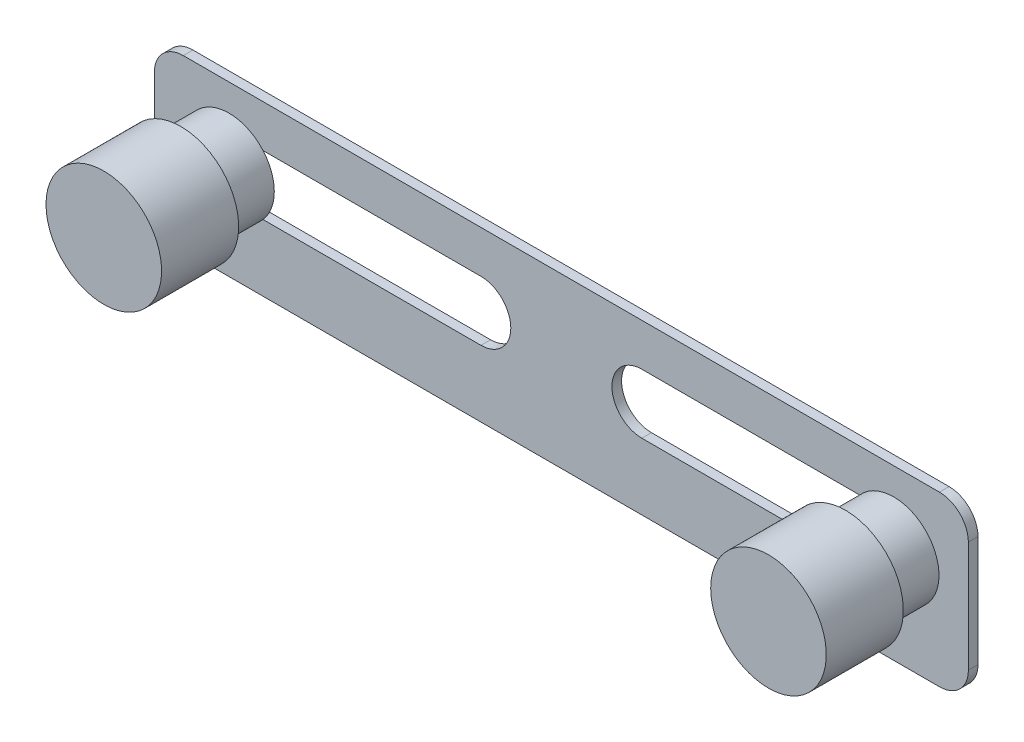
ISO-10303-21;
HEADER;
FILE_DESCRIPTION(('STEP AP214'),'2;1');
FILE_NAME('part.step','',(''),(''),'','','');
FILE_SCHEMA(('AUTOMOTIVE_DESIGN { 1 0 10303 214 1 1 1 1 }'));
ENDSEC;
DATA;
#1=APPLICATION_CONTEXT('core data for automotive mechanical design processes');
#2=APPLICATION_PROTOCOL_DEFINITION('international standard','automotive_design',2000,#1);
#3=PRODUCT_CONTEXT('',#1,'mechanical');
#4=PRODUCT('Part','Part','',(#3));
#5=PRODUCT_RELATED_PRODUCT_CATEGORY('part','',(#4));
#6=PRODUCT_DEFINITION_FORMATION('','',#4);
#7=PRODUCT_DEFINITION_CONTEXT('part definition',#1,'design');
#8=PRODUCT_DEFINITION('design','',#6,#7);
#9=PRODUCT_DEFINITION_SHAPE('','',#8);
#10=(LENGTH_UNIT() NAMED_UNIT(*) SI_UNIT(.MILLI.,.METRE.));
#11=(NAMED_UNIT(*) PLANE_ANGLE_UNIT() SI_UNIT($,.RADIAN.));
#12=(NAMED_UNIT(*) SI_UNIT($,.STERADIAN.) SOLID_ANGLE_UNIT());
#13=UNCERTAINTY_MEASURE_WITH_UNIT(LENGTH_MEASURE(1.E-05),#10,'distance_accuracy_value','');
#14=(GEOMETRIC_REPRESENTATION_CONTEXT(3) GLOBAL_UNCERTAINTY_ASSIGNED_CONTEXT((#13)) GLOBAL_UNIT_ASSIGNED_CONTEXT((#10,
#11,#12)) REPRESENTATION_CONTEXT('',''));
#15=CARTESIAN_POINT('',(0.,0.,0.));
#16=DIRECTION('',(0.,0.,1.));
#17=DIRECTION('',(1.,0.,0.));
#18=AXIS2_PLACEMENT_3D('',#15,#16,#17);
#19=CARTESIAN_POINT('',(76.75,10.,1.));
#20=DIRECTION('',(0.,0.,1.));
#21=DIRECTION('',(-1.,0.,0.));
#22=AXIS2_PLACEMENT_3D('',#19,#20,#21);
#23=PLANE('',#22);
#24=CARTESIAN_POINT('',(76.75,10.,1.));
#25=DIRECTION('',(0.,0.,1.));
#26=DIRECTION('',(1.,0.,0.));
#27=AXIS2_PLACEMENT_3D('',#24,#25,#26);
#28=CIRCLE('',#27,4.7);
#29=CARTESIAN_POINT('',(73.2172956534689,13.1,1.));
#30=VERTEX_POINT('',#29);
#31=CARTESIAN_POINT('',(73.2172956534689,6.90000000000001,1.));
#32=VERTEX_POINT('',#31);
#33=EDGE_CURVE('E11',#30,#32,#28,.T.);
#34=ORIENTED_EDGE('',*,*,#33,.F.);
#35=DIRECTION('',(-1.,0.,0.));
#36=VECTOR('',#35,1.);
#37=CARTESIAN_POINT('',(50.6,13.1,1.));
#38=LINE('',#37,#36);
#39=CARTESIAN_POINT('',(77.9,13.1,1.));
#40=VERTEX_POINT('',#39);
#41=EDGE_CURVE('E201',#40,#30,#38,.T.);
#42=ORIENTED_EDGE('',*,*,#41,.F.);
#43=CARTESIAN_POINT('',(77.9,10.,1.));
#44=DIRECTION('',(0.,0.,1.));
#45=DIRECTION('',(-1.,0.,0.));
#46=AXIS2_PLACEMENT_3D('',#43,#44,#45);
#47=CIRCLE('',#46,3.1);
#48=CARTESIAN_POINT('',(77.9,6.90000000000001,1.));
#49=VERTEX_POINT('',#48);
#50=EDGE_CURVE('E196',#49,#40,#47,.T.);
#51=ORIENTED_EDGE('',*,*,#50,.F.);
#52=DIRECTION('',(1.,0.,0.));
#53=VECTOR('',#52,1.);
#54=CARTESIAN_POINT('',(50.6,6.90000000000001,1.));
#55=LINE('',#54,#53);
#56=EDGE_CURVE('E177',#32,#49,#55,.T.);
#57=ORIENTED_EDGE('',*,*,#56,.F.);
#58=EDGE_LOOP('',(#34,#42,#51,#57));
#59=FACE_BOUND('',#58,.T.);
#60=ADVANCED_FACE('F45',(#59),#23,.F.);
#61=CARTESIAN_POINT('',(7.75,10.,1.));
#62=DIRECTION('',(0.,0.,1.));
#63=DIRECTION('',(1.,0.,0.));
#64=AXIS2_PLACEMENT_3D('',#61,#62,#63);
#65=PLANE('',#64);
#66=DIRECTION('',(-1.,0.,0.));
#67=VECTOR('',#66,1.);
#68=CARTESIAN_POINT('',(33.9,13.1,1.));
#69=LINE('',#68,#67);
#70=CARTESIAN_POINT('',(11.2827043465312,13.1,1.));
#71=VERTEX_POINT('',#70);
#72=CARTESIAN_POINT('',(6.59999999999999,13.1,1.));
#73=VERTEX_POINT('',#72);
#74=EDGE_CURVE('E326',#71,#73,#69,.T.);
#75=ORIENTED_EDGE('',*,*,#74,.F.);
#76=CARTESIAN_POINT('',(7.75,10.,1.));
#77=DIRECTION('',(0.,0.,1.));
#78=DIRECTION('',(1.,0.,0.));
#79=AXIS2_PLACEMENT_3D('',#76,#77,#78);
#80=CIRCLE('',#79,4.7);
#81=CARTESIAN_POINT('',(11.2827043465311,6.90000000000001,1.));
#82=VERTEX_POINT('',#81);
#83=EDGE_CURVE('E54',#71,#82,#80,.F.);
#84=ORIENTED_EDGE('',*,*,#83,.T.);
#85=DIRECTION('',(1.,0.,0.));
#86=VECTOR('',#85,1.);
#87=CARTESIAN_POINT('',(33.9,6.90000000000001,1.));
#88=LINE('',#87,#86);
#89=CARTESIAN_POINT('',(6.59999999999999,6.90000000000001,1.));
#90=VERTEX_POINT('',#89);
#91=EDGE_CURVE('E325',#90,#82,#88,.T.);
#92=ORIENTED_EDGE('',*,*,#91,.F.);
#93=CARTESIAN_POINT('',(6.59999999999999,10.,1.));
#94=DIRECTION('',(0.,0.,1.));
#95=DIRECTION('',(1.,0.,0.));
#96=AXIS2_PLACEMENT_3D('',#93,#94,#95);
#97=CIRCLE('',#96,3.1);
#98=EDGE_CURVE('E341',#73,#90,#97,.T.);
#99=ORIENTED_EDGE('',*,*,#98,.F.);
#100=EDGE_LOOP('',(#75,#84,#92,#99));
#101=FACE_BOUND('',#100,.T.);
#102=ADVANCED_FACE('F323',(#101),#65,.F.);
#103=CARTESIAN_POINT('',(0.,0.,1.));
#104=DIRECTION('',(0.,0.,-1.));
#105=DIRECTION('',(-1.,0.,0.));
#106=AXIS2_PLACEMENT_3D('',#103,#104,#105);
#107=PLANE('',#106);
#108=CARTESIAN_POINT('',(33.9,6.90000000000001,1.));
#109=VERTEX_POINT('',#108);
#110=EDGE_CURVE('E69',#82,#109,#88,.T.);
#111=ORIENTED_EDGE('',*,*,#110,.F.);
#112=CARTESIAN_POINT('',(7.75,10.,1.));
#113=DIRECTION('',(0.,0.,1.));
#114=DIRECTION('',(1.,0.,0.));
#115=AXIS2_PLACEMENT_3D('',#112,#113,#114);
#116=CIRCLE('',#115,4.7);
#117=EDGE_CURVE('E654',#71,#82,#116,.T.);
#118=ORIENTED_EDGE('',*,*,#117,.F.);
#119=CARTESIAN_POINT('',(33.9,13.1,1.));
#120=VERTEX_POINT('',#119);
#121=EDGE_CURVE('E675',#120,#71,#69,.T.);
#122=ORIENTED_EDGE('',*,*,#121,.F.);
#123=CARTESIAN_POINT('',(33.9,10.,1.));
#124=DIRECTION('',(0.,0.,1.));
#125=DIRECTION('',(-1.,0.,0.));
#126=AXIS2_PLACEMENT_3D('',#123,#124,#125);
#127=CIRCLE('',#126,3.1);
#128=EDGE_CURVE('E361',#109,#120,#127,.T.);
#129=ORIENTED_EDGE('',*,*,#128,.F.);
#130=EDGE_LOOP('',(#111,#118,#122,#129));
#131=FACE_BOUND('',#130,.T.);
#132=CARTESIAN_POINT('',(50.6,13.1,1.));
#133=VERTEX_POINT('',#132);
#134=EDGE_CURVE('E61',#30,#133,#38,.T.);
#135=ORIENTED_EDGE('',*,*,#134,.F.);
#136=CARTESIAN_POINT('',(76.75,10.,1.));
#137=DIRECTION('',(0.,0.,-1.));
#138=DIRECTION('',(-1.,0.,0.));
#139=AXIS2_PLACEMENT_3D('',#136,#137,#138);
#140=CIRCLE('',#139,4.7);
#141=EDGE_CURVE('E187',#30,#32,#140,.T.);
#142=ORIENTED_EDGE('',*,*,#141,.T.);
#143=CARTESIAN_POINT('',(50.6,6.90000000000001,1.));
#144=VERTEX_POINT('',#143);
#145=EDGE_CURVE('E172',#144,#32,#55,.T.);
#146=ORIENTED_EDGE('',*,*,#145,.F.);
#147=CARTESIAN_POINT('',(50.6,10.,1.));
#148=DIRECTION('',(0.,0.,1.));
#149=DIRECTION('',(1.,0.,0.));
#150=AXIS2_PLACEMENT_3D('',#147,#148,#149);
#151=CIRCLE('',#150,3.1);
#152=EDGE_CURVE('E199',#133,#144,#151,.T.);
#153=ORIENTED_EDGE('',*,*,#152,.F.);
#154=EDGE_LOOP('',(#135,#142,#146,#153));
#155=FACE_BOUND('',#154,.T.);
#156=DIRECTION('',(0.,1.,0.));
#157=VECTOR('',#156,1.);
#158=CARTESIAN_POINT('',(84.5,0.,1.));
#159=LINE('',#158,#157);
#160=CARTESIAN_POINT('',(84.5,3.,1.));
#161=VERTEX_POINT('',#160);
#162=CARTESIAN_POINT('',(84.5,14.5,1.));
#163=VERTEX_POINT('',#162);
#164=EDGE_CURVE('E243',#161,#163,#159,.T.);
#165=ORIENTED_EDGE('',*,*,#164,.T.);
#166=CARTESIAN_POINT('',(81.5,14.5,1.));
#167=DIRECTION('',(0.,0.,-1.));
#168=DIRECTION('',(-1.,0.,0.));
#169=AXIS2_PLACEMENT_3D('',#166,#167,#168);
#170=CIRCLE('',#169,3.);
#171=CARTESIAN_POINT('',(81.5,17.5,1.));
#172=VERTEX_POINT('',#171);
#173=EDGE_CURVE('E300',#163,#172,#170,.F.);
#174=ORIENTED_EDGE('',*,*,#173,.T.);
#175=DIRECTION('',(-1.,0.,0.));
#176=VECTOR('',#175,1.);
#177=CARTESIAN_POINT('',(0.,17.5,1.));
#178=LINE('',#177,#176);
#179=CARTESIAN_POINT('',(3.,17.5,1.));
#180=VERTEX_POINT('',#179);
#181=EDGE_CURVE('E247',#172,#180,#178,.T.);
#182=ORIENTED_EDGE('',*,*,#181,.T.);
#183=CARTESIAN_POINT('',(3.,14.5,1.));
#184=DIRECTION('',(0.,0.,-1.));
#185=DIRECTION('',(-1.,0.,0.));
#186=AXIS2_PLACEMENT_3D('',#183,#184,#185);
#187=CIRCLE('',#186,3.);
#188=CARTESIAN_POINT('',(0.,14.5,1.));
#189=VERTEX_POINT('',#188);
#190=EDGE_CURVE('E291',#180,#189,#187,.F.);
#191=ORIENTED_EDGE('',*,*,#190,.T.);
#192=DIRECTION('',(0.,-1.,0.));
#193=VECTOR('',#192,1.);
#194=CARTESIAN_POINT('',(0.,0.,1.));
#195=LINE('',#194,#193);
#196=CARTESIAN_POINT('',(0.,3.,1.));
#197=VERTEX_POINT('',#196);
#198=EDGE_CURVE('E234',#189,#197,#195,.T.);
#199=ORIENTED_EDGE('',*,*,#198,.T.);
#200=CARTESIAN_POINT('',(3.,3.,1.));
#201=DIRECTION('',(0.,0.,-1.));
#202=DIRECTION('',(-1.,0.,0.));
#203=AXIS2_PLACEMENT_3D('',#200,#201,#202);
#204=CIRCLE('',#203,3.);
#205=CARTESIAN_POINT('',(3.,0.,1.));
#206=VERTEX_POINT('',#205);
#207=EDGE_CURVE('E294',#197,#206,#204,.F.);
#208=ORIENTED_EDGE('',*,*,#207,.T.);
#209=DIRECTION('',(1.,0.,0.));
#210=VECTOR('',#209,1.);
#211=CARTESIAN_POINT('',(0.,0.,1.));
#212=LINE('',#211,#210);
#213=CARTESIAN_POINT('',(81.5,0.,1.));
#214=VERTEX_POINT('',#213);
#215=EDGE_CURVE('E238',#206,#214,#212,.T.);
#216=ORIENTED_EDGE('',*,*,#215,.T.);
#217=CARTESIAN_POINT('',(81.5,3.,1.));
#218=DIRECTION('',(0.,0.,-1.));
#219=DIRECTION('',(-1.,0.,0.));
#220=AXIS2_PLACEMENT_3D('',#217,#218,#219);
#221=CIRCLE('',#220,3.);
#222=EDGE_CURVE('E297',#214,#161,#221,.F.);
#223=ORIENTED_EDGE('',*,*,#222,.T.);
#224=EDGE_LOOP('',(#165,#174,#182,#191,#199,#208,#216,#223));
#225=FACE_BOUND('',#224,.T.);
#226=ADVANCED_FACE('F190',(#131,#155,#225),#107,.F.);
#227=CARTESIAN_POINT('',(0.,0.,0.));
#228=DIRECTION('',(0.,0.,-1.));
#229=DIRECTION('',(-1.,0.,0.));
#230=AXIS2_PLACEMENT_3D('',#227,#228,#229);
#231=PLANE('',#230);
#232=DIRECTION('',(-1.,0.,0.));
#233=VECTOR('',#232,1.);
#234=CARTESIAN_POINT('',(0.,17.5,0.));
#235=LINE('',#234,#233);
#236=CARTESIAN_POINT('',(81.5,17.5,0.));
#237=VERTEX_POINT('',#236);
#238=CARTESIAN_POINT('',(3.,17.5,0.));
#239=VERTEX_POINT('',#238);
#240=EDGE_CURVE('E239',#237,#239,#235,.T.);
#241=ORIENTED_EDGE('',*,*,#240,.F.);
#242=CARTESIAN_POINT('',(81.5,14.5,0.));
#243=DIRECTION('',(0.,0.,-1.));
#244=DIRECTION('',(-1.,0.,0.));
#245=AXIS2_PLACEMENT_3D('',#242,#243,#244);
#246=CIRCLE('',#245,3.);
#247=CARTESIAN_POINT('',(84.5,14.5,0.));
#248=VERTEX_POINT('',#247);
#249=EDGE_CURVE('E281',#237,#248,#246,.T.);
#250=ORIENTED_EDGE('',*,*,#249,.T.);
#251=DIRECTION('',(0.,1.,0.));
#252=VECTOR('',#251,1.);
#253=CARTESIAN_POINT('',(84.5,0.,0.));
#254=LINE('',#253,#252);
#255=CARTESIAN_POINT('',(84.5,3.,0.));
#256=VERTEX_POINT('',#255);
#257=EDGE_CURVE('E259',#256,#248,#254,.T.);
#258=ORIENTED_EDGE('',*,*,#257,.F.);
#259=CARTESIAN_POINT('',(81.5,3.,0.));
#260=DIRECTION('',(0.,0.,-1.));
#261=DIRECTION('',(-1.,0.,0.));
#262=AXIS2_PLACEMENT_3D('',#259,#260,#261);
#263=CIRCLE('',#262,3.);
#264=CARTESIAN_POINT('',(81.5,0.,0.));
#265=VERTEX_POINT('',#264);
#266=EDGE_CURVE('E278',#256,#265,#263,.T.);
#267=ORIENTED_EDGE('',*,*,#266,.T.);
#268=DIRECTION('',(1.,0.,0.));
#269=VECTOR('',#268,1.);
#270=CARTESIAN_POINT('',(0.,0.,0.));
#271=LINE('',#270,#269);
#272=CARTESIAN_POINT('',(3.,0.,0.));
#273=VERTEX_POINT('',#272);
#274=EDGE_CURVE('E255',#273,#265,#271,.T.);
#275=ORIENTED_EDGE('',*,*,#274,.F.);
#276=CARTESIAN_POINT('',(3.,3.,0.));
#277=DIRECTION('',(0.,0.,-1.));
#278=DIRECTION('',(-1.,0.,0.));
#279=AXIS2_PLACEMENT_3D('',#276,#277,#278);
#280=CIRCLE('',#279,3.);
#281=CARTESIAN_POINT('',(0.,3.,0.));
#282=VERTEX_POINT('',#281);
#283=EDGE_CURVE('E275',#273,#282,#280,.T.);
#284=ORIENTED_EDGE('',*,*,#283,.T.);
#285=DIRECTION('',(0.,-1.,0.));
#286=VECTOR('',#285,1.);
#287=CARTESIAN_POINT('',(0.,0.,0.));
#288=LINE('',#287,#286);
#289=CARTESIAN_POINT('',(0.,14.5,0.));
#290=VERTEX_POINT('',#289);
#291=EDGE_CURVE('E233',#290,#282,#288,.T.);
#292=ORIENTED_EDGE('',*,*,#291,.F.);
#293=CARTESIAN_POINT('',(3.,14.5,0.));
#294=DIRECTION('',(0.,0.,-1.));
#295=DIRECTION('',(-1.,0.,0.));
#296=AXIS2_PLACEMENT_3D('',#293,#294,#295);
#297=CIRCLE('',#296,3.);
#298=EDGE_CURVE('E272',#290,#239,#297,.T.);
#299=ORIENTED_EDGE('',*,*,#298,.T.);
#300=EDGE_LOOP('',(#241,#250,#258,#267,#275,#284,#292,#299));
#301=FACE_BOUND('',#300,.T.);
#302=DIRECTION('',(1.,0.,0.));
#303=VECTOR('',#302,1.);
#304=CARTESIAN_POINT('',(50.6,6.90000000000001,0.));
#305=LINE('',#304,#303);
#306=CARTESIAN_POINT('',(50.6,6.90000000000001,0.));
#307=VERTEX_POINT('',#306);
#308=CARTESIAN_POINT('',(77.9,6.90000000000001,0.));
#309=VERTEX_POINT('',#308);
#310=EDGE_CURVE('E218',#307,#309,#305,.T.);
#311=ORIENTED_EDGE('',*,*,#310,.T.);
#312=CARTESIAN_POINT('',(77.9,10.,0.));
#313=DIRECTION('',(0.,0.,1.));
#314=DIRECTION('',(-1.,0.,0.));
#315=AXIS2_PLACEMENT_3D('',#312,#313,#314);
#316=CIRCLE('',#315,3.1);
#317=CARTESIAN_POINT('',(77.9,13.1,0.));
#318=VERTEX_POINT('',#317);
#319=EDGE_CURVE('E205',#309,#318,#316,.T.);
#320=ORIENTED_EDGE('',*,*,#319,.T.);
#321=DIRECTION('',(-1.,0.,0.));
#322=VECTOR('',#321,1.);
#323=CARTESIAN_POINT('',(50.6,13.1,0.));
#324=LINE('',#323,#322);
#325=CARTESIAN_POINT('',(50.6,13.1,0.));
#326=VERTEX_POINT('',#325);
#327=EDGE_CURVE('E209',#318,#326,#324,.T.);
#328=ORIENTED_EDGE('',*,*,#327,.T.);
#329=CARTESIAN_POINT('',(50.6,10.,0.));
#330=DIRECTION('',(0.,0.,1.));
#331=DIRECTION('',(1.,0.,0.));
#332=AXIS2_PLACEMENT_3D('',#329,#330,#331);
#333=CIRCLE('',#332,3.1);
#334=EDGE_CURVE('E214',#326,#307,#333,.T.);
#335=ORIENTED_EDGE('',*,*,#334,.T.);
#336=EDGE_LOOP('',(#311,#320,#328,#335));
#337=FACE_BOUND('',#336,.T.);
#338=DIRECTION('',(1.,0.,0.));
#339=VECTOR('',#338,1.);
#340=CARTESIAN_POINT('',(33.9,6.90000000000001,0.));
#341=LINE('',#340,#339);
#342=CARTESIAN_POINT('',(6.59999999999999,6.90000000000001,0.));
#343=VERTEX_POINT('',#342);
#344=CARTESIAN_POINT('',(33.9,6.90000000000001,0.));
#345=VERTEX_POINT('',#344);
#346=EDGE_CURVE('E358',#343,#345,#341,.T.);
#347=ORIENTED_EDGE('',*,*,#346,.T.);
#348=CARTESIAN_POINT('',(33.9,10.,0.));
#349=DIRECTION('',(0.,0.,1.));
#350=DIRECTION('',(-1.,0.,0.));
#351=AXIS2_PLACEMENT_3D('',#348,#349,#350);
#352=CIRCLE('',#351,3.1);
#353=CARTESIAN_POINT('',(33.9,13.1,0.));
#354=VERTEX_POINT('',#353);
#355=EDGE_CURVE('E345',#345,#354,#352,.T.);
#356=ORIENTED_EDGE('',*,*,#355,.T.);
#357=DIRECTION('',(-1.,0.,0.));
#358=VECTOR('',#357,1.);
#359=CARTESIAN_POINT('',(33.9,13.1,0.));
#360=LINE('',#359,#358);
#361=CARTESIAN_POINT('',(6.59999999999999,13.1,0.));
#362=VERTEX_POINT('',#361);
#363=EDGE_CURVE('E349',#354,#362,#360,.T.);
#364=ORIENTED_EDGE('',*,*,#363,.T.);
#365=CARTESIAN_POINT('',(6.59999999999999,10.,0.));
#366=DIRECTION('',(0.,0.,1.));
#367=DIRECTION('',(1.,0.,0.));
#368=AXIS2_PLACEMENT_3D('',#365,#366,#367);
#369=CIRCLE('',#368,3.1);
#370=EDGE_CURVE('E354',#362,#343,#369,.T.);
#371=ORIENTED_EDGE('',*,*,#370,.T.);
#372=EDGE_LOOP('',(#347,#356,#364,#371));
#373=FACE_BOUND('',#372,.T.);
#374=ADVANCED_FACE('F382',(#301,#337,#373),#231,.T.);
#375=CARTESIAN_POINT('',(0.,0.,1.));
#376=DIRECTION('',(1.,0.,0.));
#377=DIRECTION('',(0.,0.,-1.));
#378=AXIS2_PLACEMENT_3D('',#375,#376,#377);
#379=PLANE('',#378);
#380=ORIENTED_EDGE('',*,*,#291,.T.);
#381=DIRECTION('',(0.,0.,-1.));
#382=VECTOR('',#381,1.);
#383=CARTESIAN_POINT('',(0.,3.,1.));
#384=LINE('',#383,#382);
#385=EDGE_CURVE('E314',#282,#197,#384,.F.);
#386=ORIENTED_EDGE('',*,*,#385,.T.);
#387=ORIENTED_EDGE('',*,*,#198,.F.);
#388=DIRECTION('',(0.,0.,-1.));
#389=VECTOR('',#388,1.);
#390=CARTESIAN_POINT('',(0.,14.5,1.));
#391=LINE('',#390,#389);
#392=EDGE_CURVE('E310',#189,#290,#391,.T.);
#393=ORIENTED_EDGE('',*,*,#392,.T.);
#394=EDGE_LOOP('',(#380,#386,#387,#393));
#395=FACE_BOUND('',#394,.T.);
#396=ADVANCED_FACE('F465',(#395),#379,.F.);
#397=CARTESIAN_POINT('',(0.,0.,1.));
#398=DIRECTION('',(0.,1.,0.));
#399=DIRECTION('',(0.,0.,1.));
#400=AXIS2_PLACEMENT_3D('',#397,#398,#399);
#401=PLANE('',#400);
#402=ORIENTED_EDGE('',*,*,#274,.T.);
#403=DIRECTION('',(0.,0.,-1.));
#404=VECTOR('',#403,1.);
#405=CARTESIAN_POINT('',(81.5,0.,1.));
#406=LINE('',#405,#404);
#407=EDGE_CURVE('E307',#265,#214,#406,.F.);
#408=ORIENTED_EDGE('',*,*,#407,.T.);
#409=ORIENTED_EDGE('',*,*,#215,.F.);
#410=DIRECTION('',(0.,0.,-1.));
#411=VECTOR('',#410,1.);
#412=CARTESIAN_POINT('',(3.,0.,1.));
#413=LINE('',#412,#411);
#414=EDGE_CURVE('E303',#206,#273,#413,.T.);
#415=ORIENTED_EDGE('',*,*,#414,.T.);
#416=EDGE_LOOP('',(#402,#408,#409,#415));
#417=FACE_BOUND('',#416,.T.);
#418=ADVANCED_FACE('F475',(#417),#401,.F.);
#419=CARTESIAN_POINT('',(84.5,0.,1.));
#420=DIRECTION('',(-1.,0.,0.));
#421=DIRECTION('',(0.,0.,1.));
#422=AXIS2_PLACEMENT_3D('',#419,#420,#421);
#423=PLANE('',#422);
#424=ORIENTED_EDGE('',*,*,#257,.T.);
#425=DIRECTION('',(0.,0.,-1.));
#426=VECTOR('',#425,1.);
#427=CARTESIAN_POINT('',(84.5,14.5,1.));
#428=LINE('',#427,#426);
#429=EDGE_CURVE('E288',#248,#163,#428,.F.);
#430=ORIENTED_EDGE('',*,*,#429,.T.);
#431=ORIENTED_EDGE('',*,*,#164,.F.);
#432=DIRECTION('',(0.,0.,-1.));
#433=VECTOR('',#432,1.);
#434=CARTESIAN_POINT('',(84.5,3.,1.));
#435=LINE('',#434,#433);
#436=EDGE_CURVE('E284',#161,#256,#435,.T.);
#437=ORIENTED_EDGE('',*,*,#436,.T.);
#438=EDGE_LOOP('',(#424,#430,#431,#437));
#439=FACE_BOUND('',#438,.T.);
#440=ADVANCED_FACE('F395',(#439),#423,.F.);
#441=CARTESIAN_POINT('',(0.,17.5,1.));
#442=DIRECTION('',(0.,-1.,0.));
#443=DIRECTION('',(0.,0.,-1.));
#444=AXIS2_PLACEMENT_3D('',#441,#442,#443);
#445=PLANE('',#444);
#446=ORIENTED_EDGE('',*,*,#181,.F.);
#447=DIRECTION('',(0.,0.,-1.));
#448=VECTOR('',#447,1.);
#449=CARTESIAN_POINT('',(81.5,17.5,1.));
#450=LINE('',#449,#448);
#451=EDGE_CURVE('E268',#172,#237,#450,.T.);
#452=ORIENTED_EDGE('',*,*,#451,.T.);
#453=ORIENTED_EDGE('',*,*,#240,.T.);
#454=DIRECTION('',(0.,0.,-1.));
#455=VECTOR('',#454,1.);
#456=CARTESIAN_POINT('',(3.,17.5,1.));
#457=LINE('',#456,#455);
#458=EDGE_CURVE('E251',#239,#180,#457,.F.);
#459=ORIENTED_EDGE('',*,*,#458,.T.);
#460=EDGE_LOOP('',(#446,#452,#453,#459));
#461=FACE_BOUND('',#460,.T.);
#462=ADVANCED_FACE('F387',(#461),#445,.F.);
#463=CARTESIAN_POINT('',(77.9,10.,1.));
#464=DIRECTION('',(0.,0.,-1.));
#465=DIRECTION('',(-1.,0.,0.));
#466=AXIS2_PLACEMENT_3D('',#463,#464,#465);
#467=CYLINDRICAL_SURFACE('',#466,3.1);
#468=ORIENTED_EDGE('',*,*,#319,.F.);
#469=DIRECTION('',(0.,0.,-1.));
#470=VECTOR('',#469,1.);
#471=CARTESIAN_POINT('',(77.9,6.90000000000001,1.));
#472=LINE('',#471,#470);
#473=EDGE_CURVE('E182',#49,#309,#472,.T.);
#474=ORIENTED_EDGE('',*,*,#473,.F.);
#475=ORIENTED_EDGE('',*,*,#50,.T.);
#476=DIRECTION('',(0.,0.,-1.));
#477=VECTOR('',#476,1.);
#478=CARTESIAN_POINT('',(77.9,13.1,1.));
#479=LINE('',#478,#477);
#480=EDGE_CURVE('E229',#40,#318,#479,.T.);
#481=ORIENTED_EDGE('',*,*,#480,.T.);
#482=EDGE_LOOP('',(#468,#474,#475,#481));
#483=FACE_BOUND('',#482,.T.);
#484=ADVANCED_FACE('F385',(#483),#467,.F.);
#485=CARTESIAN_POINT('',(50.6,13.1,1.));
#486=DIRECTION('',(0.,-1.,0.));
#487=DIRECTION('',(0.,0.,-1.));
#488=AXIS2_PLACEMENT_3D('',#485,#486,#487);
#489=PLANE('',#488);
#490=ORIENTED_EDGE('',*,*,#327,.F.);
#491=ORIENTED_EDGE('',*,*,#480,.F.);
#492=ORIENTED_EDGE('',*,*,#41,.T.);
#493=ORIENTED_EDGE('',*,*,#134,.T.);
#494=DIRECTION('',(0.,0.,-1.));
#495=VECTOR('',#494,1.);
#496=CARTESIAN_POINT('',(50.6,13.1,1.));
#497=LINE('',#496,#495);
#498=EDGE_CURVE('E226',#133,#326,#497,.T.);
#499=ORIENTED_EDGE('',*,*,#498,.T.);
#500=EDGE_LOOP('',(#490,#491,#492,#493,#499));
#501=FACE_BOUND('',#500,.T.);
#502=ADVANCED_FACE('F377',(#501),#489,.T.);
#503=CARTESIAN_POINT('',(50.6,10.,1.));
#504=DIRECTION('',(0.,0.,-1.));
#505=DIRECTION('',(-1.,0.,0.));
#506=AXIS2_PLACEMENT_3D('',#503,#504,#505);
#507=CYLINDRICAL_SURFACE('',#506,3.1);
#508=ORIENTED_EDGE('',*,*,#334,.F.);
#509=ORIENTED_EDGE('',*,*,#498,.F.);
#510=ORIENTED_EDGE('',*,*,#152,.T.);
#511=DIRECTION('',(0.,0.,-1.));
#512=VECTOR('',#511,1.);
#513=CARTESIAN_POINT('',(50.6,6.90000000000001,1.));
#514=LINE('',#513,#512);
#515=EDGE_CURVE('E179',#144,#307,#514,.T.);
#516=ORIENTED_EDGE('',*,*,#515,.T.);
#517=EDGE_LOOP('',(#508,#509,#510,#516));
#518=FACE_BOUND('',#517,.T.);
#519=ADVANCED_FACE('F380',(#518),#507,.F.);
#520=CARTESIAN_POINT('',(50.6,6.90000000000001,1.));
#521=DIRECTION('',(0.,1.,0.));
#522=DIRECTION('',(0.,0.,1.));
#523=AXIS2_PLACEMENT_3D('',#520,#521,#522);
#524=PLANE('',#523);
#525=ORIENTED_EDGE('',*,*,#310,.F.);
#526=ORIENTED_EDGE('',*,*,#515,.F.);
#527=ORIENTED_EDGE('',*,*,#145,.T.);
#528=ORIENTED_EDGE('',*,*,#56,.T.);
#529=ORIENTED_EDGE('',*,*,#473,.T.);
#530=EDGE_LOOP('',(#525,#526,#527,#528,#529));
#531=FACE_BOUND('',#530,.T.);
#532=ADVANCED_FACE('F174',(#531),#524,.T.);
#533=CARTESIAN_POINT('',(33.9,10.,1.));
#534=DIRECTION('',(0.,0.,-1.));
#535=DIRECTION('',(-1.,0.,0.));
#536=AXIS2_PLACEMENT_3D('',#533,#534,#535);
#537=CYLINDRICAL_SURFACE('',#536,3.1);
#538=ORIENTED_EDGE('',*,*,#355,.F.);
#539=DIRECTION('',(0.,0.,-1.));
#540=VECTOR('',#539,1.);
#541=CARTESIAN_POINT('',(33.9,6.90000000000001,1.));
#542=LINE('',#541,#540);
#543=EDGE_CURVE('E336',#109,#345,#542,.T.);
#544=ORIENTED_EDGE('',*,*,#543,.F.);
#545=ORIENTED_EDGE('',*,*,#128,.T.);
#546=DIRECTION('',(0.,0.,-1.));
#547=VECTOR('',#546,1.);
#548=CARTESIAN_POINT('',(33.9,13.1,1.));
#549=LINE('',#548,#547);
#550=EDGE_CURVE('E210',#120,#354,#549,.T.);
#551=ORIENTED_EDGE('',*,*,#550,.T.);
#552=EDGE_LOOP('',(#538,#544,#545,#551));
#553=FACE_BOUND('',#552,.T.);
#554=ADVANCED_FACE('F440',(#553),#537,.F.);
#555=CARTESIAN_POINT('',(33.9,13.1,1.));
#556=DIRECTION('',(0.,-1.,0.));
#557=DIRECTION('',(0.,0.,-1.));
#558=AXIS2_PLACEMENT_3D('',#555,#556,#557);
#559=PLANE('',#558);
#560=ORIENTED_EDGE('',*,*,#363,.F.);
#561=ORIENTED_EDGE('',*,*,#550,.F.);
#562=ORIENTED_EDGE('',*,*,#121,.T.);
#563=ORIENTED_EDGE('',*,*,#74,.T.);
#564=DIRECTION('',(0.,0.,-1.));
#565=VECTOR('',#564,1.);
#566=CARTESIAN_POINT('',(6.59999999999999,13.1,1.));
#567=LINE('',#566,#565);
#568=EDGE_CURVE('E365',#73,#362,#567,.T.);
#569=ORIENTED_EDGE('',*,*,#568,.T.);
#570=EDGE_LOOP('',(#560,#561,#562,#563,#569));
#571=FACE_BOUND('',#570,.T.);
#572=ADVANCED_FACE('F436',(#571),#559,.T.);
#573=CARTESIAN_POINT('',(6.59999999999999,10.,1.));
#574=DIRECTION('',(0.,0.,-1.));
#575=DIRECTION('',(-1.,0.,0.));
#576=AXIS2_PLACEMENT_3D('',#573,#574,#575);
#577=CYLINDRICAL_SURFACE('',#576,3.1);
#578=ORIENTED_EDGE('',*,*,#370,.F.);
#579=ORIENTED_EDGE('',*,*,#568,.F.);
#580=ORIENTED_EDGE('',*,*,#98,.T.);
#581=DIRECTION('',(0.,0.,-1.));
#582=VECTOR('',#581,1.);
#583=CARTESIAN_POINT('',(6.59999999999999,6.90000000000001,1.));
#584=LINE('',#583,#582);
#585=EDGE_CURVE('E333',#90,#343,#584,.T.);
#586=ORIENTED_EDGE('',*,*,#585,.T.);
#587=EDGE_LOOP('',(#578,#579,#580,#586));
#588=FACE_BOUND('',#587,.T.);
#589=ADVANCED_FACE('F433',(#588),#577,.F.);
#590=CARTESIAN_POINT('',(33.9,6.90000000000001,1.));
#591=DIRECTION('',(0.,1.,0.));
#592=DIRECTION('',(0.,0.,1.));
#593=AXIS2_PLACEMENT_3D('',#590,#591,#592);
#594=PLANE('',#593);
#595=ORIENTED_EDGE('',*,*,#346,.F.);
#596=ORIENTED_EDGE('',*,*,#585,.F.);
#597=ORIENTED_EDGE('',*,*,#91,.T.);
#598=ORIENTED_EDGE('',*,*,#110,.T.);
#599=ORIENTED_EDGE('',*,*,#543,.T.);
#600=EDGE_LOOP('',(#595,#596,#597,#598,#599));
#601=FACE_BOUND('',#600,.T.);
#602=ADVANCED_FACE('F330',(#601),#594,.T.);
#603=CARTESIAN_POINT('',(81.5,14.5,1.));
#604=DIRECTION('',(0.,0.,-1.));
#605=DIRECTION('',(-1.,0.,0.));
#606=AXIS2_PLACEMENT_3D('',#603,#604,#605);
#607=CYLINDRICAL_SURFACE('',#606,3.);
#608=ORIENTED_EDGE('',*,*,#173,.F.);
#609=ORIENTED_EDGE('',*,*,#429,.F.);
#610=ORIENTED_EDGE('',*,*,#249,.F.);
#611=ORIENTED_EDGE('',*,*,#451,.F.);
#612=EDGE_LOOP('',(#608,#609,#610,#611));
#613=FACE_BOUND('',#612,.T.);
#614=ADVANCED_FACE('F432',(#613),#607,.T.);
#615=CARTESIAN_POINT('',(81.5,3.,1.));
#616=DIRECTION('',(0.,0.,-1.));
#617=DIRECTION('',(-1.,0.,0.));
#618=AXIS2_PLACEMENT_3D('',#615,#616,#617);
#619=CYLINDRICAL_SURFACE('',#618,3.);
#620=ORIENTED_EDGE('',*,*,#222,.F.);
#621=ORIENTED_EDGE('',*,*,#407,.F.);
#622=ORIENTED_EDGE('',*,*,#266,.F.);
#623=ORIENTED_EDGE('',*,*,#436,.F.);
#624=EDGE_LOOP('',(#620,#621,#622,#623));
#625=FACE_BOUND('',#624,.T.);
#626=ADVANCED_FACE('F505',(#625),#619,.T.);
#627=CARTESIAN_POINT('',(3.,3.,1.));
#628=DIRECTION('',(0.,0.,-1.));
#629=DIRECTION('',(-1.,0.,0.));
#630=AXIS2_PLACEMENT_3D('',#627,#628,#629);
#631=CYLINDRICAL_SURFACE('',#630,3.);
#632=ORIENTED_EDGE('',*,*,#207,.F.);
#633=ORIENTED_EDGE('',*,*,#385,.F.);
#634=ORIENTED_EDGE('',*,*,#283,.F.);
#635=ORIENTED_EDGE('',*,*,#414,.F.);
#636=EDGE_LOOP('',(#632,#633,#634,#635));
#637=FACE_BOUND('',#636,.T.);
#638=ADVANCED_FACE('F515',(#637),#631,.T.);
#639=CARTESIAN_POINT('',(3.,14.5,1.));
#640=DIRECTION('',(0.,0.,-1.));
#641=DIRECTION('',(-1.,0.,0.));
#642=AXIS2_PLACEMENT_3D('',#639,#640,#641);
#643=CYLINDRICAL_SURFACE('',#642,3.);
#644=ORIENTED_EDGE('',*,*,#190,.F.);
#645=ORIENTED_EDGE('',*,*,#458,.F.);
#646=ORIENTED_EDGE('',*,*,#298,.F.);
#647=ORIENTED_EDGE('',*,*,#392,.F.);
#648=EDGE_LOOP('',(#644,#645,#646,#647));
#649=FACE_BOUND('',#648,.T.);
#650=ADVANCED_FACE('F47',(#649),#643,.T.);
#651=CARTESIAN_POINT('',(7.75,10.,6.));
#652=DIRECTION('',(0.,0.,1.));
#653=DIRECTION('',(1.,0.,0.));
#654=AXIS2_PLACEMENT_3D('',#651,#652,#653);
#655=PLANE('',#654);
#656=CARTESIAN_POINT('',(7.75,10.,6.));
#657=DIRECTION('',(0.,0.,1.));
#658=DIRECTION('',(1.,0.,0.));
#659=AXIS2_PLACEMENT_3D('',#656,#657,#658);
#660=CIRCLE('',#659,6.);
#661=CARTESIAN_POINT('',(1.75000000000001,10.,6.));
#662=VERTEX_POINT('',#661);
#663=EDGE_CURVE('E666',#662,#662,#660,.T.);
#664=ORIENTED_EDGE('',*,*,#663,.F.);
#665=EDGE_LOOP('',(#664));
#666=FACE_BOUND('',#665,.T.);
#667=CARTESIAN_POINT('',(7.75,10.,6.));
#668=DIRECTION('',(0.,0.,1.));
#669=DIRECTION('',(1.,0.,0.));
#670=AXIS2_PLACEMENT_3D('',#667,#668,#669);
#671=CIRCLE('',#670,4.7);
#672=CARTESIAN_POINT('',(12.45,10.,6.));
#673=VERTEX_POINT('',#672);
#674=EDGE_CURVE('E659',#673,#673,#671,.T.);
#675=ORIENTED_EDGE('',*,*,#674,.T.);
#676=EDGE_LOOP('',(#675));
#677=FACE_BOUND('',#676,.T.);
#678=ADVANCED_FACE('F418',(#666,#677),#655,.F.);
#679=CARTESIAN_POINT('',(7.75,10.,6.));
#680=DIRECTION('',(0.,0.,-1.));
#681=DIRECTION('',(-1.,0.,0.));
#682=AXIS2_PLACEMENT_3D('',#679,#680,#681);
#683=CYLINDRICAL_SURFACE('',#682,4.7);
#684=ORIENTED_EDGE('',*,*,#674,.F.);
#685=EDGE_LOOP('',(#684));
#686=FACE_BOUND('',#685,.T.);
#687=ORIENTED_EDGE('',*,*,#117,.T.);
#688=ORIENTED_EDGE('',*,*,#83,.F.);
#689=EDGE_LOOP('',(#687,#688));
#690=FACE_BOUND('',#689,.T.);
#691=ADVANCED_FACE('F414',(#686,#690),#683,.T.);
#692=CARTESIAN_POINT('',(7.75,10.,14.));
#693=DIRECTION('',(0.,0.,1.));
#694=DIRECTION('',(1.,0.,0.));
#695=AXIS2_PLACEMENT_3D('',#692,#693,#694);
#696=PLANE('',#695);
#697=CARTESIAN_POINT('',(7.75,10.,14.));
#698=DIRECTION('',(0.,0.,1.));
#699=DIRECTION('',(1.,0.,0.));
#700=AXIS2_PLACEMENT_3D('',#697,#698,#699);
#701=CIRCLE('',#700,6.);
#702=CARTESIAN_POINT('',(1.75000000000001,10.,14.));
#703=VERTEX_POINT('',#702);
#704=EDGE_CURVE('E350',#703,#703,#701,.T.);
#705=ORIENTED_EDGE('',*,*,#704,.T.);
#706=EDGE_LOOP('',(#705));
#707=FACE_BOUND('',#706,.T.);
#708=ADVANCED_FACE('F417',(#707),#696,.T.);
#709=CARTESIAN_POINT('',(7.75,10.,14.));
#710=DIRECTION('',(0.,0.,-1.));
#711=DIRECTION('',(-1.,0.,0.));
#712=AXIS2_PLACEMENT_3D('',#709,#710,#711);
#713=CYLINDRICAL_SURFACE('',#712,6.);
#714=CARTESIAN_POINT('',(1.75000000000001,10.,6.));
#715=CARTESIAN_POINT('',(1.75000000000001,10.,6.08333333333333));
#716=CARTESIAN_POINT('',(1.75000000000001,10.,6.16666666666667));
#717=CARTESIAN_POINT('',(1.75000000000001,10.,6.33333333333333));
#718=CARTESIAN_POINT('',(1.75000000000001,10.,6.41666666666667));
#719=CARTESIAN_POINT('',(1.75000000000001,10.,6.58333333333333));
#720=CARTESIAN_POINT('',(1.75000000000001,10.,6.66666666666667));
#721=CARTESIAN_POINT('',(1.75000000000001,10.,6.83333333333333));
#722=CARTESIAN_POINT('',(1.75000000000001,10.,6.91666666666667));
#723=CARTESIAN_POINT('',(1.75000000000001,10.,7.08333333333333));
#724=CARTESIAN_POINT('',(1.75000000000001,10.,7.16666666666667));
#725=CARTESIAN_POINT('',(1.75000000000001,10.,7.33333333333333));
#726=CARTESIAN_POINT('',(1.75000000000001,10.,7.41666666666667));
#727=CARTESIAN_POINT('',(1.75000000000001,10.,7.58333333333333));
#728=CARTESIAN_POINT('',(1.75000000000001,10.,7.66666666666667));
#729=CARTESIAN_POINT('',(1.75000000000001,10.,7.83333333333333));
#730=CARTESIAN_POINT('',(1.75000000000001,10.,7.91666666666667));
#731=CARTESIAN_POINT('',(1.75000000000001,10.,8.08333333333333));
#732=CARTESIAN_POINT('',(1.75000000000001,10.,8.16666666666667));
#733=CARTESIAN_POINT('',(1.75000000000001,10.,8.33333333333333));
#734=CARTESIAN_POINT('',(1.75000000000001,10.,8.41666666666667));
#735=CARTESIAN_POINT('',(1.75000000000001,10.,8.58333333333333));
#736=CARTESIAN_POINT('',(1.75000000000001,10.,8.66666666666667));
#737=CARTESIAN_POINT('',(1.75000000000001,10.,8.83333333333333));
#738=CARTESIAN_POINT('',(1.75000000000001,10.,8.91666666666667));
#739=CARTESIAN_POINT('',(1.75000000000001,10.,9.08333333333333));
#740=CARTESIAN_POINT('',(1.75000000000001,10.,9.16666666666667));
#741=CARTESIAN_POINT('',(1.75000000000001,10.,9.33333333333333));
#742=CARTESIAN_POINT('',(1.75000000000001,10.,9.41666666666667));
#743=CARTESIAN_POINT('',(1.75000000000001,10.,9.58333333333333));
#744=CARTESIAN_POINT('',(1.75000000000001,10.,9.66666666666667));
#745=CARTESIAN_POINT('',(1.75000000000001,10.,9.83333333333333));
#746=CARTESIAN_POINT('',(1.75000000000001,10.,9.91666666666667));
#747=CARTESIAN_POINT('',(1.75000000000001,10.,10.0833333333333));
#748=CARTESIAN_POINT('',(1.75000000000001,10.,10.1666666666667));
#749=CARTESIAN_POINT('',(1.75000000000001,10.,10.3333333333333));
#750=CARTESIAN_POINT('',(1.75000000000001,10.,10.4166666666667));
#751=CARTESIAN_POINT('',(1.75000000000001,10.,10.5833333333333));
#752=CARTESIAN_POINT('',(1.75000000000001,10.,10.6666666666667));
#753=CARTESIAN_POINT('',(1.75000000000001,10.,10.8333333333333));
#754=CARTESIAN_POINT('',(1.75000000000001,10.,10.9166666666667));
#755=CARTESIAN_POINT('',(1.75000000000001,10.,11.0833333333333));
#756=CARTESIAN_POINT('',(1.75000000000001,10.,11.1666666666667));
#757=CARTESIAN_POINT('',(1.75000000000001,10.,11.3333333333333));
#758=CARTESIAN_POINT('',(1.75000000000001,10.,11.4166666666667));
#759=CARTESIAN_POINT('',(1.75000000000001,10.,11.5833333333333));
#760=CARTESIAN_POINT('',(1.75000000000001,10.,11.6666666666667));
#761=CARTESIAN_POINT('',(1.75000000000001,10.,11.8333333333333));
#762=CARTESIAN_POINT('',(1.75000000000001,10.,11.9166666666667));
#763=CARTESIAN_POINT('',(1.75000000000001,10.,12.0833333333333));
#764=CARTESIAN_POINT('',(1.75000000000001,10.,12.1666666666667));
#765=CARTESIAN_POINT('',(1.75000000000001,10.,12.3333333333333));
#766=CARTESIAN_POINT('',(1.75000000000001,10.,12.4166666666667));
#767=CARTESIAN_POINT('',(1.75000000000001,10.,12.5833333333333));
#768=CARTESIAN_POINT('',(1.75000000000001,10.,12.6666666666667));
#769=CARTESIAN_POINT('',(1.75000000000001,10.,12.8333333333333));
#770=CARTESIAN_POINT('',(1.75000000000001,10.,12.9166666666667));
#771=CARTESIAN_POINT('',(1.75000000000001,10.,13.0833333333333));
#772=CARTESIAN_POINT('',(1.75000000000001,10.,13.1666666666667));
#773=CARTESIAN_POINT('',(1.75000000000001,10.,13.3333333333333));
#774=CARTESIAN_POINT('',(1.75000000000001,10.,13.4166666666667));
#775=CARTESIAN_POINT('',(1.75000000000001,10.,13.5833333333333));
#776=CARTESIAN_POINT('',(1.75000000000001,10.,13.6666666666667));
#777=CARTESIAN_POINT('',(1.75000000000001,10.,13.8333333333333));
#778=CARTESIAN_POINT('',(1.75000000000001,10.,13.9166666666667));
#779=CARTESIAN_POINT('',(1.75000000000001,10.,14.));
#780=B_SPLINE_CURVE_WITH_KNOTS('',3,(#714,#715,#716,#717,#718,#719,#720,#721,#722,#723,#724,
#725,#726,#727,#728,#729,#730,#731,#732,#733,#734,#735,#736,#737,#738,#739,#740,#741,#742,#743,
#744,#745,#746,#747,#748,#749,#750,#751,#752,#753,#754,#755,#756,#757,#758,#759,#760,#761,#762,
#763,#764,#765,#766,#767,#768,#769,#770,#771,#772,#773,#774,#775,#776,#777,#778,#779),
.UNSPECIFIED.,.F.,.F.,(4,2,2,2,2,2,2,2,2,2,2,2,2,2,2,2,2,2,2,2,2,2,2,2,2,2,2,2,2,2,2,2,4),(0.,
0.249999999999999,0.5,0.749999999999999,0.999999999999999,1.25,1.5,1.75,2.,2.25,2.5,2.75,3.,
3.25,3.5,3.75,4.,4.25,4.5,4.75,5.,5.25,5.5,5.75,6.,6.25,6.5,6.75,7.,7.25,7.5,7.75,8.),.UNSPECIFIED.);
#781=EDGE_CURVE('BSEAM424',#662,#703,#780,.T.);
#782=ORIENTED_EDGE('',*,*,#663,.T.);
#783=ORIENTED_EDGE('',*,*,#704,.F.);
#784=ORIENTED_EDGE('',*,*,#781,.T.);
#785=ORIENTED_EDGE('',*,*,#781,.F.);
#786=EDGE_LOOP('',(#782,#784,#783,#785));
#787=FACE_BOUND('',#786,.T.);
#788=ADVANCED_FACE('F424',(#787),#713,.T.);
#789=CARTESIAN_POINT('',(76.75,10.,6.));
#790=DIRECTION('',(0.,0.,1.));
#791=DIRECTION('',(-1.,0.,0.));
#792=AXIS2_PLACEMENT_3D('',#789,#790,#791);
#793=PLANE('',#792);
#794=CARTESIAN_POINT('',(76.75,10.,6.));
#795=DIRECTION('',(0.,0.,-1.));
#796=DIRECTION('',(-1.,0.,0.));
#797=AXIS2_PLACEMENT_3D('',#794,#795,#796);
#798=CIRCLE('',#797,4.7);
#799=CARTESIAN_POINT('',(72.05,10.,6.));
#800=VERTEX_POINT('',#799);
#801=EDGE_CURVE('E193',#800,#800,#798,.T.);
#802=ORIENTED_EDGE('',*,*,#801,.F.);
#803=EDGE_LOOP('',(#802));
#804=FACE_BOUND('',#803,.T.);
#805=CARTESIAN_POINT('',(76.75,10.,6.));
#806=DIRECTION('',(0.,0.,-1.));
#807=DIRECTION('',(-1.,0.,0.));
#808=AXIS2_PLACEMENT_3D('',#805,#806,#807);
#809=CIRCLE('',#808,6.);
#810=CARTESIAN_POINT('',(70.75,10.,6.));
#811=VERTEX_POINT('',#810);
#812=EDGE_CURVE('E655',#811,#811,#809,.T.);
#813=ORIENTED_EDGE('',*,*,#812,.T.);
#814=EDGE_LOOP('',(#813));
#815=FACE_BOUND('',#814,.T.);
#816=ADVANCED_FACE('F428',(#804,#815),#793,.F.);
#817=CARTESIAN_POINT('',(76.75,10.,6.));
#818=DIRECTION('',(0.,0.,-1.));
#819=DIRECTION('',(-1.,0.,0.));
#820=AXIS2_PLACEMENT_3D('',#817,#818,#819);
#821=CYLINDRICAL_SURFACE('',#820,4.7);
#822=ORIENTED_EDGE('',*,*,#801,.T.);
#823=EDGE_LOOP('',(#822));
#824=FACE_BOUND('',#823,.T.);
#825=ORIENTED_EDGE('',*,*,#141,.F.);
#826=ORIENTED_EDGE('',*,*,#33,.T.);
#827=EDGE_LOOP('',(#825,#826));
#828=FACE_BOUND('',#827,.T.);
#829=ADVANCED_FACE('F186',(#824,#828),#821,.T.);
#830=CARTESIAN_POINT('',(76.75,10.,14.));
#831=DIRECTION('',(0.,0.,1.));
#832=DIRECTION('',(-1.,0.,0.));
#833=AXIS2_PLACEMENT_3D('',#830,#831,#832);
#834=PLANE('',#833);
#835=CARTESIAN_POINT('',(76.75,10.,14.));
#836=DIRECTION('',(0.,0.,-1.));
#837=DIRECTION('',(-1.,0.,0.));
#838=AXIS2_PLACEMENT_3D('',#835,#836,#837);
#839=CIRCLE('',#838,6.);
#840=CARTESIAN_POINT('',(70.75,10.,14.));
#841=VERTEX_POINT('',#840);
#842=EDGE_CURVE('E651',#841,#841,#839,.T.);
#843=ORIENTED_EDGE('',*,*,#842,.F.);
#844=EDGE_LOOP('',(#843));
#845=FACE_BOUND('',#844,.T.);
#846=ADVANCED_FACE('F408',(#845),#834,.T.);
#847=CARTESIAN_POINT('',(76.75,10.,14.));
#848=DIRECTION('',(0.,0.,-1.));
#849=DIRECTION('',(-1.,0.,0.));
#850=AXIS2_PLACEMENT_3D('',#847,#848,#849);
#851=CYLINDRICAL_SURFACE('',#850,6.);
#852=CARTESIAN_POINT('',(70.75,10.,6.));
#853=CARTESIAN_POINT('',(70.75,10.,6.08333333333333));
#854=CARTESIAN_POINT('',(70.75,10.,6.16666666666667));
#855=CARTESIAN_POINT('',(70.75,10.,6.33333333333333));
#856=CARTESIAN_POINT('',(70.75,10.,6.41666666666667));
#857=CARTESIAN_POINT('',(70.75,10.,6.58333333333333));
#858=CARTESIAN_POINT('',(70.75,10.,6.66666666666667));
#859=CARTESIAN_POINT('',(70.75,10.,6.83333333333333));
#860=CARTESIAN_POINT('',(70.75,10.,6.91666666666667));
#861=CARTESIAN_POINT('',(70.75,10.,7.08333333333333));
#862=CARTESIAN_POINT('',(70.75,10.,7.16666666666667));
#863=CARTESIAN_POINT('',(70.75,10.,7.33333333333333));
#864=CARTESIAN_POINT('',(70.75,10.,7.41666666666667));
#865=CARTESIAN_POINT('',(70.75,10.,7.58333333333333));
#866=CARTESIAN_POINT('',(70.75,10.,7.66666666666667));
#867=CARTESIAN_POINT('',(70.75,10.,7.83333333333333));
#868=CARTESIAN_POINT('',(70.75,10.,7.91666666666667));
#869=CARTESIAN_POINT('',(70.75,10.,8.08333333333333));
#870=CARTESIAN_POINT('',(70.75,10.,8.16666666666667));
#871=CARTESIAN_POINT('',(70.75,10.,8.33333333333333));
#872=CARTESIAN_POINT('',(70.75,10.,8.41666666666667));
#873=CARTESIAN_POINT('',(70.75,10.,8.58333333333333));
#874=CARTESIAN_POINT('',(70.75,10.,8.66666666666667));
#875=CARTESIAN_POINT('',(70.75,10.,8.83333333333333));
#876=CARTESIAN_POINT('',(70.75,10.,8.91666666666667));
#877=CARTESIAN_POINT('',(70.75,10.,9.08333333333333));
#878=CARTESIAN_POINT('',(70.75,10.,9.16666666666667));
#879=CARTESIAN_POINT('',(70.75,10.,9.33333333333333));
#880=CARTESIAN_POINT('',(70.75,10.,9.41666666666667));
#881=CARTESIAN_POINT('',(70.75,10.,9.58333333333333));
#882=CARTESIAN_POINT('',(70.75,10.,9.66666666666667));
#883=CARTESIAN_POINT('',(70.75,10.,9.83333333333333));
#884=CARTESIAN_POINT('',(70.75,10.,9.91666666666667));
#885=CARTESIAN_POINT('',(70.75,10.,10.0833333333333));
#886=CARTESIAN_POINT('',(70.75,10.,10.1666666666667));
#887=CARTESIAN_POINT('',(70.75,10.,10.3333333333333));
#888=CARTESIAN_POINT('',(70.75,10.,10.4166666666667));
#889=CARTESIAN_POINT('',(70.75,10.,10.5833333333333));
#890=CARTESIAN_POINT('',(70.75,10.,10.6666666666667));
#891=CARTESIAN_POINT('',(70.75,10.,10.8333333333333));
#892=CARTESIAN_POINT('',(70.75,10.,10.9166666666667));
#893=CARTESIAN_POINT('',(70.75,10.,11.0833333333333));
#894=CARTESIAN_POINT('',(70.75,10.,11.1666666666667));
#895=CARTESIAN_POINT('',(70.75,10.,11.3333333333333));
#896=CARTESIAN_POINT('',(70.75,10.,11.4166666666667));
#897=CARTESIAN_POINT('',(70.75,10.,11.5833333333333));
#898=CARTESIAN_POINT('',(70.75,10.,11.6666666666667));
#899=CARTESIAN_POINT('',(70.75,10.,11.8333333333333));
#900=CARTESIAN_POINT('',(70.75,10.,11.9166666666667));
#901=CARTESIAN_POINT('',(70.75,10.,12.0833333333333));
#902=CARTESIAN_POINT('',(70.75,10.,12.1666666666667));
#903=CARTESIAN_POINT('',(70.75,10.,12.3333333333333));
#904=CARTESIAN_POINT('',(70.75,10.,12.4166666666667));
#905=CARTESIAN_POINT('',(70.75,10.,12.5833333333333));
#906=CARTESIAN_POINT('',(70.75,10.,12.6666666666667));
#907=CARTESIAN_POINT('',(70.75,10.,12.8333333333333));
#908=CARTESIAN_POINT('',(70.75,10.,12.9166666666667));
#909=CARTESIAN_POINT('',(70.75,10.,13.0833333333333));
#910=CARTESIAN_POINT('',(70.75,10.,13.1666666666667));
#911=CARTESIAN_POINT('',(70.75,10.,13.3333333333333));
#912=CARTESIAN_POINT('',(70.75,10.,13.4166666666667));
#913=CARTESIAN_POINT('',(70.75,10.,13.5833333333333));
#914=CARTESIAN_POINT('',(70.75,10.,13.6666666666667));
#915=CARTESIAN_POINT('',(70.75,10.,13.8333333333333));
#916=CARTESIAN_POINT('',(70.75,10.,13.9166666666667));
#917=CARTESIAN_POINT('',(70.75,10.,14.));
#918=B_SPLINE_CURVE_WITH_KNOTS('',3,(#852,#853,#854,#855,#856,#857,#858,#859,#860,#861,#862,
#863,#864,#865,#866,#867,#868,#869,#870,#871,#872,#873,#874,#875,#876,#877,#878,#879,#880,#881,
#882,#883,#884,#885,#886,#887,#888,#889,#890,#891,#892,#893,#894,#895,#896,#897,#898,#899,#900,
#901,#902,#903,#904,#905,#906,#907,#908,#909,#910,#911,#912,#913,#914,#915,#916,#917),
.UNSPECIFIED.,.F.,.F.,(4,2,2,2,2,2,2,2,2,2,2,2,2,2,2,2,2,2,2,2,2,2,2,2,2,2,2,2,2,2,2,2,4),(0.,
0.249999999999999,0.5,0.75,0.999999999999999,1.25,1.5,1.75,2.,2.25,2.5,2.75,3.,3.25,3.5,3.75,4.,
4.25,4.5,4.75,5.,5.25,5.5,5.75,6.,6.25,6.5,6.75,7.,7.25,7.5,7.75,8.),.UNSPECIFIED.);
#919=EDGE_CURVE('BSEAM410',#811,#841,#918,.T.);
#920=ORIENTED_EDGE('',*,*,#812,.F.);
#921=ORIENTED_EDGE('',*,*,#842,.T.);
#922=ORIENTED_EDGE('',*,*,#919,.T.);
#923=ORIENTED_EDGE('',*,*,#919,.F.);
#924=EDGE_LOOP('',(#920,#922,#921,#923));
#925=FACE_BOUND('',#924,.T.);
#926=ADVANCED_FACE('F410',(#925),#851,.T.);
#927=CLOSED_SHELL('',(#60,#102,#226,#374,#396,#418,#440,#462,#484,#502,#519,#532,#554,#572,#589,
#602,#614,#626,#638,#650,#678,#691,#708,#788,#816,#829,#846,#926));
#928=MANIFOLD_SOLID_BREP('B2',#927);
#929=ADVANCED_BREP_SHAPE_REPRESENTATION('',(#18,#928),#14);
#930=SHAPE_DEFINITION_REPRESENTATION(#9,#929);
ENDSEC;
END-ISO-10303-21;
